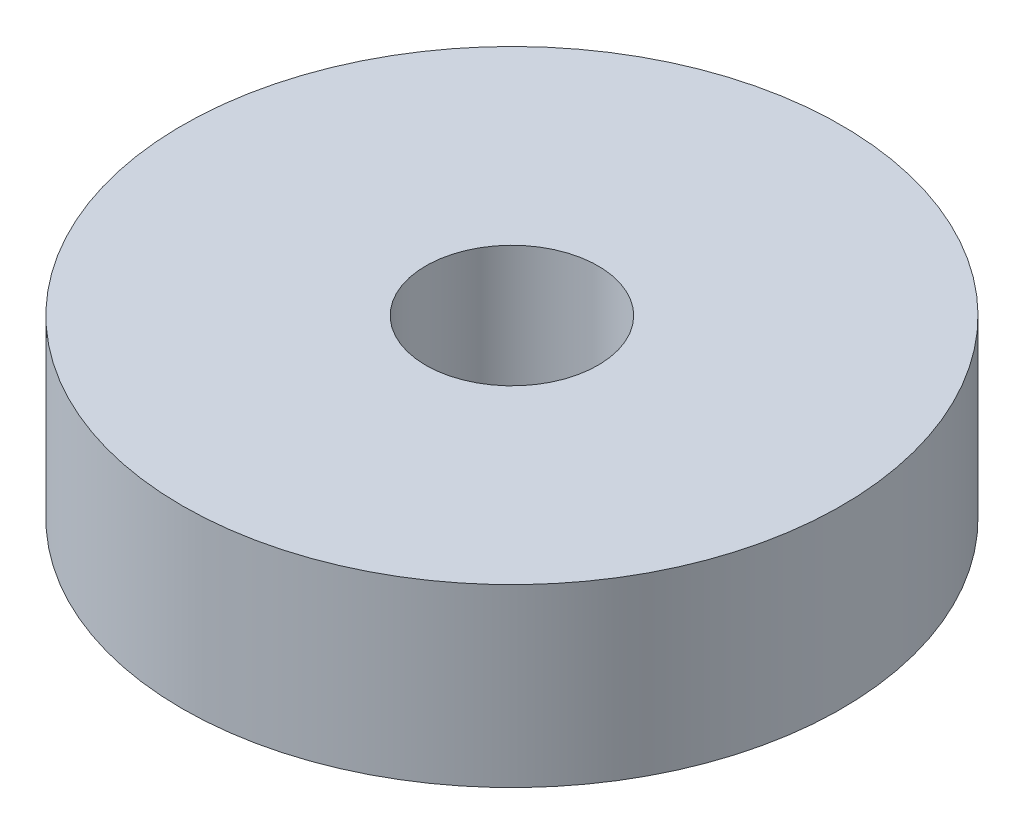
ISO-10303-21;
HEADER;
FILE_DESCRIPTION(('STEP AP214'),'2;1');
FILE_NAME('part.step','',(''),(''),'','','');
FILE_SCHEMA(('AUTOMOTIVE_DESIGN { 1 0 10303 214 1 1 1 1 }'));
ENDSEC;
DATA;
#1=APPLICATION_CONTEXT('core data for automotive mechanical design processes');
#2=APPLICATION_PROTOCOL_DEFINITION('international standard','automotive_design',2000,#1);
#3=PRODUCT_CONTEXT('',#1,'mechanical');
#4=PRODUCT('Part','Part','',(#3));
#5=PRODUCT_RELATED_PRODUCT_CATEGORY('part','',(#4));
#6=PRODUCT_DEFINITION_FORMATION('','',#4);
#7=PRODUCT_DEFINITION_CONTEXT('part definition',#1,'design');
#8=PRODUCT_DEFINITION('design','',#6,#7);
#9=PRODUCT_DEFINITION_SHAPE('','',#8);
#10=(LENGTH_UNIT() NAMED_UNIT(*) SI_UNIT(.MILLI.,.METRE.));
#11=(NAMED_UNIT(*) PLANE_ANGLE_UNIT() SI_UNIT($,.RADIAN.));
#12=(NAMED_UNIT(*) SI_UNIT($,.STERADIAN.) SOLID_ANGLE_UNIT());
#13=UNCERTAINTY_MEASURE_WITH_UNIT(LENGTH_MEASURE(1.E-05),#10,'distance_accuracy_value','');
#14=(GEOMETRIC_REPRESENTATION_CONTEXT(3) GLOBAL_UNCERTAINTY_ASSIGNED_CONTEXT((#13)) GLOBAL_UNIT_ASSIGNED_CONTEXT((#10,
#11,#12)) REPRESENTATION_CONTEXT('',''));
#15=CARTESIAN_POINT('',(0.,0.,0.));
#16=DIRECTION('',(0.,0.,1.));
#17=DIRECTION('',(1.,0.,0.));
#18=AXIS2_PLACEMENT_3D('',#15,#16,#17);
#19=CARTESIAN_POINT('',(0.,5.08,0.));
#20=DIRECTION('',(0.,-1.,0.));
#21=DIRECTION('',(0.,0.,-1.));
#22=AXIS2_PLACEMENT_3D('',#19,#20,#21);
#23=CYLINDRICAL_SURFACE('',#22,9.525);
#24=CARTESIAN_POINT('',(0.,5.08,0.));
#25=DIRECTION('',(0.,1.,0.));
#26=DIRECTION('',(0.,0.,1.));
#27=AXIS2_PLACEMENT_3D('',#24,#25,#26);
#28=CIRCLE('',#27,9.525);
#29=CARTESIAN_POINT('',(0.,5.08,9.525));
#30=VERTEX_POINT('',#29);
#31=EDGE_CURVE('E10',#30,#30,#28,.T.);
#32=ORIENTED_EDGE('',*,*,#31,.F.);
#33=EDGE_LOOP('',(#32));
#34=FACE_BOUND('',#33,.T.);
#35=CARTESIAN_POINT('',(0.,0.,0.));
#36=DIRECTION('',(0.,1.,0.));
#37=DIRECTION('',(0.,0.,1.));
#38=AXIS2_PLACEMENT_3D('',#35,#36,#37);
#39=CIRCLE('',#38,9.525);
#40=CARTESIAN_POINT('',(0.,0.,9.525));
#41=VERTEX_POINT('',#40);
#42=EDGE_CURVE('E34',#41,#41,#39,.T.);
#43=ORIENTED_EDGE('',*,*,#42,.T.);
#44=EDGE_LOOP('',(#43));
#45=FACE_BOUND('',#44,.T.);
#46=ADVANCED_FACE('F31',(#34,#45),#23,.T.);
#47=CARTESIAN_POINT('',(0.,5.08,0.));
#48=DIRECTION('',(0.,1.,0.));
#49=DIRECTION('',(0.,0.,1.));
#50=AXIS2_PLACEMENT_3D('',#47,#48,#49);
#51=PLANE('',#50);
#52=CARTESIAN_POINT('',(0.,5.08,0.));
#53=DIRECTION('',(0.,1.,0.));
#54=DIRECTION('',(0.,0.,1.));
#55=AXIS2_PLACEMENT_3D('',#52,#53,#54);
#56=CIRCLE('',#55,2.48919999999998);
#57=CARTESIAN_POINT('',(0.,5.08,2.48919999999998));
#58=VERTEX_POINT('',#57);
#59=EDGE_CURVE('E45',#58,#58,#56,.T.);
#60=ORIENTED_EDGE('',*,*,#59,.F.);
#61=EDGE_LOOP('',(#60));
#62=FACE_BOUND('',#61,.T.);
#63=ORIENTED_EDGE('',*,*,#31,.T.);
#64=EDGE_LOOP('',(#63));
#65=FACE_BOUND('',#64,.T.);
#66=ADVANCED_FACE('F51',(#62,#65),#51,.T.);
#67=CARTESIAN_POINT('',(0.,0.,0.));
#68=DIRECTION('',(0.,1.,0.));
#69=DIRECTION('',(0.,0.,1.));
#70=AXIS2_PLACEMENT_3D('',#67,#68,#69);
#71=PLANE('',#70);
#72=CARTESIAN_POINT('',(0.,0.,0.));
#73=DIRECTION('',(0.,1.,0.));
#74=DIRECTION('',(0.,0.,1.));
#75=AXIS2_PLACEMENT_3D('',#72,#73,#74);
#76=CIRCLE('',#75,2.4892);
#77=CARTESIAN_POINT('',(0.,0.,2.4892));
#78=VERTEX_POINT('',#77);
#79=EDGE_CURVE('E41',#78,#78,#76,.T.);
#80=ORIENTED_EDGE('',*,*,#79,.T.);
#81=EDGE_LOOP('',(#80));
#82=FACE_BOUND('',#81,.T.);
#83=ORIENTED_EDGE('',*,*,#42,.F.);
#84=EDGE_LOOP('',(#83));
#85=FACE_BOUND('',#84,.T.);
#86=ADVANCED_FACE('F53',(#82,#85),#71,.F.);
#87=CARTESIAN_POINT('',(0.,5.08,0.));
#88=DIRECTION('',(0.,1.,0.));
#89=DIRECTION('',(0.,0.,1.));
#90=AXIS2_PLACEMENT_3D('',#87,#88,#89);
#91=CYLINDRICAL_SURFACE('',#90,2.48919999999999);
#92=ORIENTED_EDGE('',*,*,#79,.F.);
#93=EDGE_LOOP('',(#92));
#94=FACE_BOUND('',#93,.T.);
#95=ORIENTED_EDGE('',*,*,#59,.T.);
#96=EDGE_LOOP('',(#95));
#97=FACE_BOUND('',#96,.T.);
#98=ADVANCED_FACE('F49',(#94,#97),#91,.F.);
#99=CLOSED_SHELL('',(#46,#66,#86,#98));
#100=MANIFOLD_SOLID_BREP('B2',#99);
#101=ADVANCED_BREP_SHAPE_REPRESENTATION('',(#18,#100),#14);
#102=SHAPE_DEFINITION_REPRESENTATION(#9,#101);
ENDSEC;
END-ISO-10303-21;
